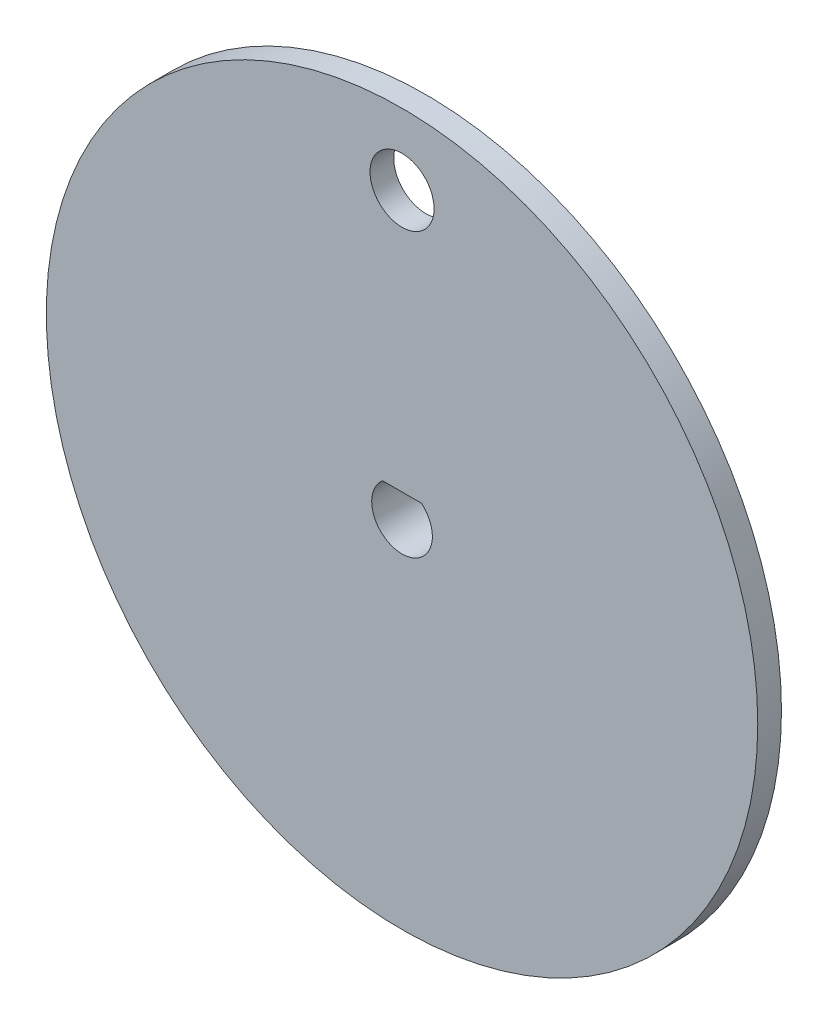
ISO-10303-21;
HEADER;
FILE_DESCRIPTION(('STEP AP214'),'2;1');
FILE_NAME('part.step','',(''),(''),'','','');
FILE_SCHEMA(('AUTOMOTIVE_DESIGN { 1 0 10303 214 1 1 1 1 }'));
ENDSEC;
DATA;
#1=APPLICATION_CONTEXT('core data for automotive mechanical design processes');
#2=APPLICATION_PROTOCOL_DEFINITION('international standard','automotive_design',2000,#1);
#3=PRODUCT_CONTEXT('',#1,'mechanical');
#4=PRODUCT('Part','Part','',(#3));
#5=PRODUCT_RELATED_PRODUCT_CATEGORY('part','',(#4));
#6=PRODUCT_DEFINITION_FORMATION('','',#4);
#7=PRODUCT_DEFINITION_CONTEXT('part definition',#1,'design');
#8=PRODUCT_DEFINITION('design','',#6,#7);
#9=PRODUCT_DEFINITION_SHAPE('','',#8);
#10=(LENGTH_UNIT() NAMED_UNIT(*) SI_UNIT(.MILLI.,.METRE.));
#11=(NAMED_UNIT(*) PLANE_ANGLE_UNIT() SI_UNIT($,.RADIAN.));
#12=(NAMED_UNIT(*) SI_UNIT($,.STERADIAN.) SOLID_ANGLE_UNIT());
#13=UNCERTAINTY_MEASURE_WITH_UNIT(LENGTH_MEASURE(1.E-05),#10,'distance_accuracy_value','');
#14=(GEOMETRIC_REPRESENTATION_CONTEXT(3) GLOBAL_UNCERTAINTY_ASSIGNED_CONTEXT((#13)) GLOBAL_UNIT_ASSIGNED_CONTEXT((#10,
#11,#12)) REPRESENTATION_CONTEXT('',''));
#15=CARTESIAN_POINT('',(0.,0.,0.));
#16=DIRECTION('',(0.,0.,1.));
#17=DIRECTION('',(1.,0.,0.));
#18=AXIS2_PLACEMENT_3D('',#15,#16,#17);
#19=CARTESIAN_POINT('',(0.,0.,2.54));
#20=DIRECTION('',(0.,0.,-1.));
#21=DIRECTION('',(-1.,0.,0.));
#22=AXIS2_PLACEMENT_3D('',#19,#20,#21);
#23=CYLINDRICAL_SURFACE('',#22,38.1);
#24=CARTESIAN_POINT('',(0.,0.,2.54));
#25=DIRECTION('',(0.,0.,1.));
#26=DIRECTION('',(1.,0.,0.));
#27=AXIS2_PLACEMENT_3D('',#24,#25,#26);
#28=CIRCLE('',#27,38.1);
#29=CARTESIAN_POINT('',(38.1,0.,2.54));
#30=VERTEX_POINT('',#29);
#31=EDGE_CURVE('E46',#30,#30,#28,.T.);
#32=ORIENTED_EDGE('',*,*,#31,.F.);
#33=EDGE_LOOP('',(#32));
#34=FACE_BOUND('',#33,.T.);
#35=CARTESIAN_POINT('',(0.,0.,0.));
#36=DIRECTION('',(0.,0.,1.));
#37=DIRECTION('',(1.,0.,0.));
#38=AXIS2_PLACEMENT_3D('',#35,#36,#37);
#39=CIRCLE('',#38,38.1);
#40=CARTESIAN_POINT('',(38.1,0.,0.));
#41=VERTEX_POINT('',#40);
#42=EDGE_CURVE('E90',#41,#41,#39,.T.);
#43=ORIENTED_EDGE('',*,*,#42,.T.);
#44=EDGE_LOOP('',(#43));
#45=FACE_BOUND('',#44,.T.);
#46=ADVANCED_FACE('F38',(#34,#45),#23,.T.);
#47=CARTESIAN_POINT('',(0.,0.,2.54));
#48=DIRECTION('',(0.,0.,1.));
#49=DIRECTION('',(1.,0.,0.));
#50=AXIS2_PLACEMENT_3D('',#47,#48,#49);
#51=PLANE('',#50);
#52=CARTESIAN_POINT('',(0.,0.,2.54));
#53=DIRECTION('',(0.,0.,-1.));
#54=DIRECTION('',(-1.,0.,0.));
#55=AXIS2_PLACEMENT_3D('',#52,#53,#54);
#56=CIRCLE('',#55,3.25);
#57=CARTESIAN_POINT('',(2.07665596572952,2.5,2.54));
#58=VERTEX_POINT('',#57);
#59=CARTESIAN_POINT('',(-2.07665596572952,2.5,2.54));
#60=VERTEX_POINT('',#59);
#61=EDGE_CURVE('E54',#58,#60,#56,.T.);
#62=ORIENTED_EDGE('',*,*,#61,.T.);
#63=DIRECTION('',(1.,0.,0.));
#64=VECTOR('',#63,1.);
#65=CARTESIAN_POINT('',(2.07665596572952,2.5,2.54));
#66=LINE('',#65,#64);
#67=EDGE_CURVE('E82',#60,#58,#66,.T.);
#68=ORIENTED_EDGE('',*,*,#67,.T.);
#69=EDGE_LOOP('',(#62,#68));
#70=FACE_BOUND('',#69,.T.);
#71=CARTESIAN_POINT('',(0.,30.48,2.54));
#72=DIRECTION('',(0.,0.,1.));
#73=DIRECTION('',(1.,0.,0.));
#74=AXIS2_PLACEMENT_3D('',#71,#72,#73);
#75=CIRCLE('',#74,3.429);
#76=CARTESIAN_POINT('',(3.429,30.48,2.54));
#77=VERTEX_POINT('',#76);
#78=EDGE_CURVE('E70',#77,#77,#75,.T.);
#79=ORIENTED_EDGE('',*,*,#78,.F.);
#80=EDGE_LOOP('',(#79));
#81=FACE_BOUND('',#80,.T.);
#82=ORIENTED_EDGE('',*,*,#31,.T.);
#83=EDGE_LOOP('',(#82));
#84=FACE_BOUND('',#83,.T.);
#85=ADVANCED_FACE('F100',(#70,#81,#84),#51,.T.);
#86=CARTESIAN_POINT('',(0.,0.,0.));
#87=DIRECTION('',(0.,0.,1.));
#88=DIRECTION('',(1.,0.,0.));
#89=AXIS2_PLACEMENT_3D('',#86,#87,#88);
#90=PLANE('',#89);
#91=CARTESIAN_POINT('',(0.,30.48,0.));
#92=DIRECTION('',(0.,0.,1.));
#93=DIRECTION('',(1.,0.,0.));
#94=AXIS2_PLACEMENT_3D('',#91,#92,#93);
#95=CIRCLE('',#94,3.429);
#96=CARTESIAN_POINT('',(3.429,30.48,0.));
#97=VERTEX_POINT('',#96);
#98=EDGE_CURVE('E41',#97,#97,#95,.T.);
#99=ORIENTED_EDGE('',*,*,#98,.T.);
#100=EDGE_LOOP('',(#99));
#101=FACE_BOUND('',#100,.T.);
#102=CARTESIAN_POINT('',(0.,0.,0.));
#103=DIRECTION('',(0.,0.,-1.));
#104=DIRECTION('',(-1.,0.,0.));
#105=AXIS2_PLACEMENT_3D('',#102,#103,#104);
#106=CIRCLE('',#105,6.35);
#107=CARTESIAN_POINT('',(6.35,0.,0.));
#108=VERTEX_POINT('',#107);
#109=EDGE_CURVE('E11',#108,#108,#106,.T.);
#110=ORIENTED_EDGE('',*,*,#109,.F.);
#111=EDGE_LOOP('',(#110));
#112=FACE_BOUND('',#111,.T.);
#113=ORIENTED_EDGE('',*,*,#42,.F.);
#114=EDGE_LOOP('',(#113));
#115=FACE_BOUND('',#114,.T.);
#116=ADVANCED_FACE('F97',(#101,#112,#115),#90,.F.);
#117=CARTESIAN_POINT('',(0.,0.,-19.05));
#118=DIRECTION('',(0.,0.,1.));
#119=DIRECTION('',(1.,0.,0.));
#120=AXIS2_PLACEMENT_3D('',#117,#118,#119);
#121=CYLINDRICAL_SURFACE('',#120,6.35);
#122=CARTESIAN_POINT('',(0.,0.,-19.05));
#123=DIRECTION('',(0.,0.,-1.));
#124=DIRECTION('',(-1.,0.,0.));
#125=AXIS2_PLACEMENT_3D('',#122,#123,#124);
#126=CIRCLE('',#125,6.35);
#127=CARTESIAN_POINT('',(6.35,0.,-19.05));
#128=VERTEX_POINT('',#127);
#129=EDGE_CURVE('E88',#128,#128,#126,.T.);
#130=CARTESIAN_POINT('',(6.35,0.,-19.05));
#131=CARTESIAN_POINT('',(6.35,0.,-18.8515625));
#132=CARTESIAN_POINT('',(6.35,0.,-18.653125));
#133=CARTESIAN_POINT('',(6.35,0.,-18.25625));
#134=CARTESIAN_POINT('',(6.35,0.,-18.0578125));
#135=CARTESIAN_POINT('',(6.35,0.,-17.6609375));
#136=CARTESIAN_POINT('',(6.35,0.,-17.4625));
#137=CARTESIAN_POINT('',(6.35,0.,-17.065625));
#138=CARTESIAN_POINT('',(6.35,0.,-16.8671875));
#139=CARTESIAN_POINT('',(6.35,0.,-16.4703125));
#140=CARTESIAN_POINT('',(6.35,0.,-16.271875));
#141=CARTESIAN_POINT('',(6.35,0.,-15.875));
#142=CARTESIAN_POINT('',(6.35,0.,-15.6765625));
#143=CARTESIAN_POINT('',(6.35,0.,-15.2796875));
#144=CARTESIAN_POINT('',(6.35,0.,-15.08125));
#145=CARTESIAN_POINT('',(6.35,0.,-14.684375));
#146=CARTESIAN_POINT('',(6.35,0.,-14.4859375));
#147=CARTESIAN_POINT('',(6.35,0.,-14.0890625));
#148=CARTESIAN_POINT('',(6.35,0.,-13.890625));
#149=CARTESIAN_POINT('',(6.35,0.,-13.49375));
#150=CARTESIAN_POINT('',(6.35,0.,-13.2953125));
#151=CARTESIAN_POINT('',(6.35,0.,-12.8984375));
#152=CARTESIAN_POINT('',(6.35,0.,-12.7));
#153=CARTESIAN_POINT('',(6.35,0.,-12.303125));
#154=CARTESIAN_POINT('',(6.35,0.,-12.1046875));
#155=CARTESIAN_POINT('',(6.35,0.,-11.7078125));
#156=CARTESIAN_POINT('',(6.35,0.,-11.509375));
#157=CARTESIAN_POINT('',(6.35,0.,-11.1125));
#158=CARTESIAN_POINT('',(6.35,0.,-10.9140625));
#159=CARTESIAN_POINT('',(6.35,0.,-10.5171875));
#160=CARTESIAN_POINT('',(6.35,0.,-10.31875));
#161=CARTESIAN_POINT('',(6.35,0.,-9.921875));
#162=CARTESIAN_POINT('',(6.35,0.,-9.7234375));
#163=CARTESIAN_POINT('',(6.35,0.,-9.3265625));
#164=CARTESIAN_POINT('',(6.35,0.,-9.128125));
#165=CARTESIAN_POINT('',(6.35,0.,-8.73125));
#166=CARTESIAN_POINT('',(6.35,0.,-8.5328125));
#167=CARTESIAN_POINT('',(6.35,0.,-8.1359375));
#168=CARTESIAN_POINT('',(6.35,0.,-7.9375));
#169=CARTESIAN_POINT('',(6.35,0.,-7.540625));
#170=CARTESIAN_POINT('',(6.35,0.,-7.3421875));
#171=CARTESIAN_POINT('',(6.35,0.,-6.9453125));
#172=CARTESIAN_POINT('',(6.35,0.,-6.746875));
#173=CARTESIAN_POINT('',(6.35,0.,-6.35));
#174=CARTESIAN_POINT('',(6.35,0.,-6.1515625));
#175=CARTESIAN_POINT('',(6.35,0.,-5.7546875));
#176=CARTESIAN_POINT('',(6.35,0.,-5.55625));
#177=CARTESIAN_POINT('',(6.35,0.,-5.159375));
#178=CARTESIAN_POINT('',(6.35,0.,-4.9609375));
#179=CARTESIAN_POINT('',(6.35,0.,-4.5640625));
#180=CARTESIAN_POINT('',(6.35,0.,-4.365625));
#181=CARTESIAN_POINT('',(6.35,0.,-3.96875));
#182=CARTESIAN_POINT('',(6.35,0.,-3.7703125));
#183=CARTESIAN_POINT('',(6.35,0.,-3.3734375));
#184=CARTESIAN_POINT('',(6.35,0.,-3.175));
#185=CARTESIAN_POINT('',(6.35,0.,-2.778125));
#186=CARTESIAN_POINT('',(6.35,0.,-2.5796875));
#187=CARTESIAN_POINT('',(6.35,0.,-2.1828125));
#188=CARTESIAN_POINT('',(6.35,0.,-1.984375));
#189=CARTESIAN_POINT('',(6.35,0.,-1.5875));
#190=CARTESIAN_POINT('',(6.35,0.,-1.3890625));
#191=CARTESIAN_POINT('',(6.35,0.,-0.992187500000001));
#192=CARTESIAN_POINT('',(6.35,0.,-0.793750000000001));
#193=CARTESIAN_POINT('',(6.35,0.,-0.396875));
#194=CARTESIAN_POINT('',(6.35,0.,-0.1984375));
#195=CARTESIAN_POINT('',(6.35,0.,0.));
#196=B_SPLINE_CURVE_WITH_KNOTS('',3,(#130,#131,#132,#133,#134,#135,#136,#137,#138,#139,#140,
#141,#142,#143,#144,#145,#146,#147,#148,#149,#150,#151,#152,#153,#154,#155,#156,#157,#158,#159,
#160,#161,#162,#163,#164,#165,#166,#167,#168,#169,#170,#171,#172,#173,#174,#175,#176,#177,#178,
#179,#180,#181,#182,#183,#184,#185,#186,#187,#188,#189,#190,#191,#192,#193,#194,#195),
.UNSPECIFIED.,.F.,.F.,(4,2,2,2,2,2,2,2,2,2,2,2,2,2,2,2,2,2,2,2,2,2,2,2,2,2,2,2,2,2,2,2,4),(0.,
0.5953125,1.190625,1.7859375,2.38125,2.9765625,3.571875,4.1671875,4.7625,5.3578125,5.953125,
6.5484375,7.14375,7.7390625,8.334375,8.9296875,9.525,10.1203125,10.715625,11.3109375,11.90625,
12.5015625,13.096875,13.6921875,14.2875,14.8828125,15.478125,16.0734375,16.66875,17.2640625,
17.859375,18.4546875,19.05),.UNSPECIFIED.);
#197=EDGE_CURVE('BSEAM99',#128,#108,#196,.T.);
#198=ORIENTED_EDGE('',*,*,#129,.F.);
#199=ORIENTED_EDGE('',*,*,#109,.T.);
#200=ORIENTED_EDGE('',*,*,#197,.T.);
#201=ORIENTED_EDGE('',*,*,#197,.F.);
#202=EDGE_LOOP('',(#198,#200,#199,#201));
#203=FACE_BOUND('',#202,.T.);
#204=ADVANCED_FACE('F99',(#203),#121,.T.);
#205=CARTESIAN_POINT('',(0.,0.,-19.05));
#206=DIRECTION('',(0.,0.,-1.));
#207=DIRECTION('',(-1.,0.,0.));
#208=AXIS2_PLACEMENT_3D('',#205,#206,#207);
#209=PLANE('',#208);
#210=CARTESIAN_POINT('',(0.,0.,-19.05));
#211=DIRECTION('',(0.,0.,-1.));
#212=DIRECTION('',(-1.,0.,0.));
#213=AXIS2_PLACEMENT_3D('',#210,#211,#212);
#214=CIRCLE('',#213,3.25);
#215=CARTESIAN_POINT('',(2.07665596572952,2.5,-19.05));
#216=VERTEX_POINT('',#215);
#217=CARTESIAN_POINT('',(-2.07665596572952,2.5,-19.05));
#218=VERTEX_POINT('',#217);
#219=EDGE_CURVE('E59',#216,#218,#214,.T.);
#220=ORIENTED_EDGE('',*,*,#219,.F.);
#221=DIRECTION('',(1.,0.,0.));
#222=VECTOR('',#221,1.);
#223=CARTESIAN_POINT('',(2.07665596572952,2.5,-19.05));
#224=LINE('',#223,#222);
#225=EDGE_CURVE('E74',#218,#216,#224,.T.);
#226=ORIENTED_EDGE('',*,*,#225,.F.);
#227=EDGE_LOOP('',(#220,#226));
#228=FACE_BOUND('',#227,.T.);
#229=ORIENTED_EDGE('',*,*,#129,.T.);
#230=EDGE_LOOP('',(#229));
#231=FACE_BOUND('',#230,.T.);
#232=ADVANCED_FACE('F78',(#228,#231),#209,.T.);
#233=CARTESIAN_POINT('',(0.,30.48,-19.05));
#234=DIRECTION('',(0.,0.,1.));
#235=DIRECTION('',(1.,0.,0.));
#236=AXIS2_PLACEMENT_3D('',#233,#234,#235);
#237=CYLINDRICAL_SURFACE('',#236,3.429);
#238=ORIENTED_EDGE('',*,*,#78,.T.);
#239=EDGE_LOOP('',(#238));
#240=FACE_BOUND('',#239,.T.);
#241=ORIENTED_EDGE('',*,*,#98,.F.);
#242=EDGE_LOOP('',(#241));
#243=FACE_BOUND('',#242,.T.);
#244=ADVANCED_FACE('F138',(#240,#243),#237,.F.);
#245=CARTESIAN_POINT('',(0.,0.,2.54));
#246=DIRECTION('',(0.,0.,-1.));
#247=DIRECTION('',(-1.,0.,0.));
#248=AXIS2_PLACEMENT_3D('',#245,#246,#247);
#249=CYLINDRICAL_SURFACE('',#248,3.25);
#250=ORIENTED_EDGE('',*,*,#219,.T.);
#251=DIRECTION('',(0.,0.,-1.));
#252=VECTOR('',#251,1.);
#253=CARTESIAN_POINT('',(-2.07665596572952,2.5,2.54));
#254=LINE('',#253,#252);
#255=EDGE_CURVE('E71',#60,#218,#254,.T.);
#256=ORIENTED_EDGE('',*,*,#255,.F.);
#257=ORIENTED_EDGE('',*,*,#61,.F.);
#258=DIRECTION('',(0.,0.,-1.));
#259=VECTOR('',#258,1.);
#260=CARTESIAN_POINT('',(2.07665596572952,2.5,2.54));
#261=LINE('',#260,#259);
#262=EDGE_CURVE('E64',#58,#216,#261,.T.);
#263=ORIENTED_EDGE('',*,*,#262,.T.);
#264=EDGE_LOOP('',(#250,#256,#257,#263));
#265=FACE_BOUND('',#264,.T.);
#266=ADVANCED_FACE('F66',(#265),#249,.F.);
#267=CARTESIAN_POINT('',(2.07665596572952,2.5,2.54));
#268=DIRECTION('',(0.,1.,0.));
#269=DIRECTION('',(0.,0.,1.));
#270=AXIS2_PLACEMENT_3D('',#267,#268,#269);
#271=PLANE('',#270);
#272=ORIENTED_EDGE('',*,*,#225,.T.);
#273=ORIENTED_EDGE('',*,*,#262,.F.);
#274=ORIENTED_EDGE('',*,*,#67,.F.);
#275=ORIENTED_EDGE('',*,*,#255,.T.);
#276=EDGE_LOOP('',(#272,#273,#274,#275));
#277=FACE_BOUND('',#276,.T.);
#278=ADVANCED_FACE('F75',(#277),#271,.F.);
#279=CLOSED_SHELL('',(#46,#85,#116,#204,#232,#244,#266,#278));
#280=MANIFOLD_SOLID_BREP('B2',#279);
#281=ADVANCED_BREP_SHAPE_REPRESENTATION('',(#18,#280),#14);
#282=SHAPE_DEFINITION_REPRESENTATION(#9,#281);
ENDSEC;
END-ISO-10303-21;
